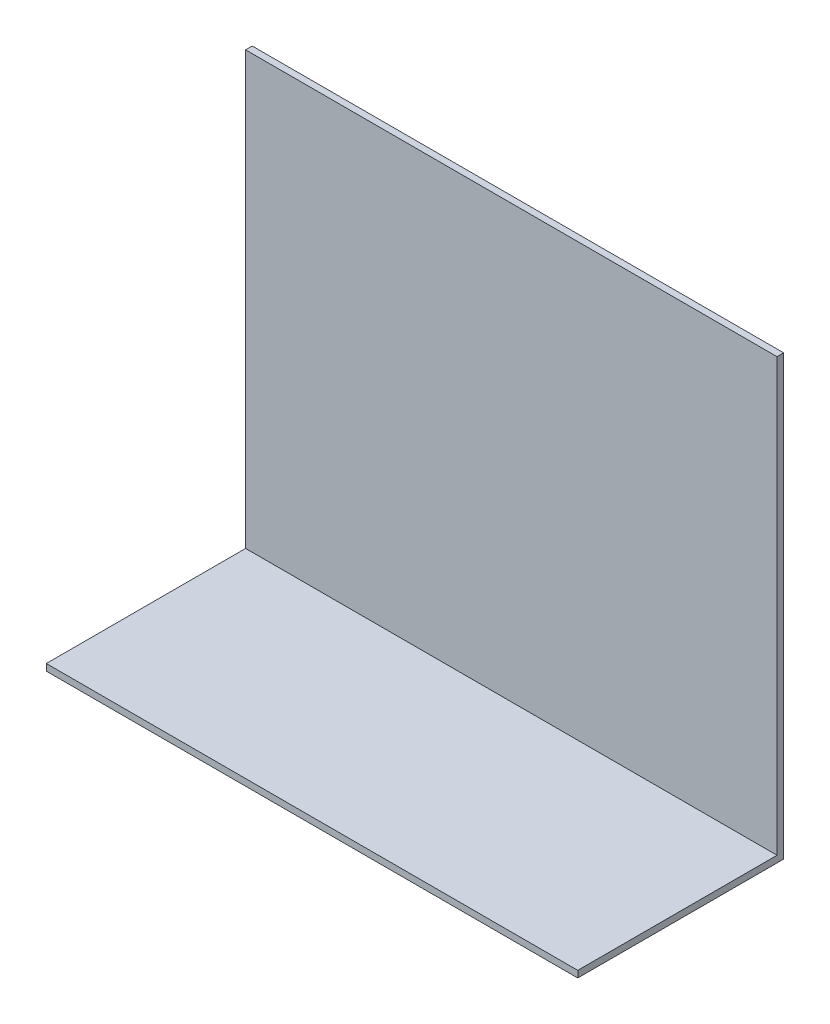
ISO-10303-21;
HEADER;
FILE_DESCRIPTION(('STEP AP214'),'2;1');
FILE_NAME('part.step','',(''),(''),'','','');
FILE_SCHEMA(('AUTOMOTIVE_DESIGN { 1 0 10303 214 1 1 1 1 }'));
ENDSEC;
DATA;
#1=APPLICATION_CONTEXT('core data for automotive mechanical design processes');
#2=APPLICATION_PROTOCOL_DEFINITION('international standard','automotive_design',2000,#1);
#3=PRODUCT_CONTEXT('',#1,'mechanical');
#4=PRODUCT('Part','Part','',(#3));
#5=PRODUCT_RELATED_PRODUCT_CATEGORY('part','',(#4));
#6=PRODUCT_DEFINITION_FORMATION('','',#4);
#7=PRODUCT_DEFINITION_CONTEXT('part definition',#1,'design');
#8=PRODUCT_DEFINITION('design','',#6,#7);
#9=PRODUCT_DEFINITION_SHAPE('','',#8);
#10=(LENGTH_UNIT() NAMED_UNIT(*) SI_UNIT(.MILLI.,.METRE.));
#11=(NAMED_UNIT(*) PLANE_ANGLE_UNIT() SI_UNIT($,.RADIAN.));
#12=(NAMED_UNIT(*) SI_UNIT($,.STERADIAN.) SOLID_ANGLE_UNIT());
#13=UNCERTAINTY_MEASURE_WITH_UNIT(LENGTH_MEASURE(1.E-05),#10,'distance_accuracy_value','');
#14=(GEOMETRIC_REPRESENTATION_CONTEXT(3) GLOBAL_UNCERTAINTY_ASSIGNED_CONTEXT((#13)) GLOBAL_UNIT_ASSIGNED_CONTEXT((#10,
#11,#12)) REPRESENTATION_CONTEXT('',''));
#15=CARTESIAN_POINT('',(0.,0.,0.));
#16=DIRECTION('',(0.,0.,1.));
#17=DIRECTION('',(1.,0.,0.));
#18=AXIS2_PLACEMENT_3D('',#15,#16,#17);
#19=CARTESIAN_POINT('',(0.,0.,5.));
#20=DIRECTION('',(0.,0.,-1.));
#21=DIRECTION('',(-1.,0.,0.));
#22=AXIS2_PLACEMENT_3D('',#19,#20,#21);
#23=PLANE('',#22);
#24=DIRECTION('',(-1.,0.,0.));
#25=VECTOR('',#24,1.);
#26=CARTESIAN_POINT('',(0.,-160.,5.));
#27=LINE('',#26,#25);
#28=CARTESIAN_POINT('',(200.,-160.,5.));
#29=VERTEX_POINT('',#28);
#30=CARTESIAN_POINT('',(-200.,-160.,5.));
#31=VERTEX_POINT('',#30);
#32=EDGE_CURVE('E48',#29,#31,#27,.T.);
#33=ORIENTED_EDGE('',*,*,#32,.F.);
#34=DIRECTION('',(0.,1.,0.));
#35=VECTOR('',#34,1.);
#36=CARTESIAN_POINT('',(200.,-165.,5.));
#37=LINE('',#36,#35);
#38=CARTESIAN_POINT('',(200.,165.,5.));
#39=VERTEX_POINT('',#38);
#40=EDGE_CURVE('E86',#29,#39,#37,.T.);
#41=ORIENTED_EDGE('',*,*,#40,.T.);
#42=DIRECTION('',(-1.,0.,0.));
#43=VECTOR('',#42,1.);
#44=CARTESIAN_POINT('',(-200.,165.,5.));
#45=LINE('',#44,#43);
#46=CARTESIAN_POINT('',(-200.,165.,5.));
#47=VERTEX_POINT('',#46);
#48=EDGE_CURVE('E54',#39,#47,#45,.T.);
#49=ORIENTED_EDGE('',*,*,#48,.T.);
#50=DIRECTION('',(0.,-1.,0.));
#51=VECTOR('',#50,1.);
#52=CARTESIAN_POINT('',(-200.,-165.,5.));
#53=LINE('',#52,#51);
#54=EDGE_CURVE('E97',#47,#31,#53,.T.);
#55=ORIENTED_EDGE('',*,*,#54,.T.);
#56=EDGE_LOOP('',(#33,#41,#49,#55));
#57=FACE_BOUND('',#56,.T.);
#58=ADVANCED_FACE('F33',(#57),#23,.F.);
#59=CARTESIAN_POINT('',(200.,-165.,5.));
#60=DIRECTION('',(-1.,0.,0.));
#61=DIRECTION('',(0.,0.,1.));
#62=AXIS2_PLACEMENT_3D('',#59,#60,#61);
#63=PLANE('',#62);
#64=DIRECTION('',(0.,1.,0.));
#65=VECTOR('',#64,1.);
#66=CARTESIAN_POINT('',(200.,-165.,0.));
#67=LINE('',#66,#65);
#68=CARTESIAN_POINT('',(200.,-165.,0.));
#69=VERTEX_POINT('',#68);
#70=CARTESIAN_POINT('',(200.,165.,0.));
#71=VERTEX_POINT('',#70);
#72=EDGE_CURVE('E93',#69,#71,#67,.T.);
#73=ORIENTED_EDGE('',*,*,#72,.T.);
#74=DIRECTION('',(0.,0.,-1.));
#75=VECTOR('',#74,1.);
#76=CARTESIAN_POINT('',(200.,165.,5.));
#77=LINE('',#76,#75);
#78=EDGE_CURVE('E11',#39,#71,#77,.T.);
#79=ORIENTED_EDGE('',*,*,#78,.F.);
#80=ORIENTED_EDGE('',*,*,#40,.F.);
#81=DIRECTION('',(0.,0.,-1.));
#82=VECTOR('',#81,1.);
#83=CARTESIAN_POINT('',(200.,-160.,155.));
#84=LINE('',#83,#82);
#85=CARTESIAN_POINT('',(200.,-160.,155.));
#86=VERTEX_POINT('',#85);
#87=EDGE_CURVE('E105',#86,#29,#84,.T.);
#88=ORIENTED_EDGE('',*,*,#87,.F.);
#89=DIRECTION('',(0.,1.,0.));
#90=VECTOR('',#89,1.);
#91=CARTESIAN_POINT('',(200.,0.,155.));
#92=LINE('',#91,#90);
#93=CARTESIAN_POINT('',(200.,-165.,155.));
#94=VERTEX_POINT('',#93);
#95=EDGE_CURVE('E96',#94,#86,#92,.T.);
#96=ORIENTED_EDGE('',*,*,#95,.F.);
#97=DIRECTION('',(0.,0.,-1.));
#98=VECTOR('',#97,1.);
#99=CARTESIAN_POINT('',(200.,-165.,5.));
#100=LINE('',#99,#98);
#101=EDGE_CURVE('E79',#94,#69,#100,.T.);
#102=ORIENTED_EDGE('',*,*,#101,.T.);
#103=EDGE_LOOP('',(#73,#79,#80,#88,#96,#102));
#104=FACE_BOUND('',#103,.T.);
#105=ADVANCED_FACE('F35',(#104),#63,.F.);
#106=CARTESIAN_POINT('',(-200.,165.,5.));
#107=DIRECTION('',(0.,-1.,0.));
#108=DIRECTION('',(0.,0.,-1.));
#109=AXIS2_PLACEMENT_3D('',#106,#107,#108);
#110=PLANE('',#109);
#111=DIRECTION('',(-1.,0.,0.));
#112=VECTOR('',#111,1.);
#113=CARTESIAN_POINT('',(-200.,165.,0.));
#114=LINE('',#113,#112);
#115=CARTESIAN_POINT('',(-200.,165.,0.));
#116=VERTEX_POINT('',#115);
#117=EDGE_CURVE('E100',#71,#116,#114,.T.);
#118=ORIENTED_EDGE('',*,*,#117,.T.);
#119=DIRECTION('',(0.,0.,-1.));
#120=VECTOR('',#119,1.);
#121=CARTESIAN_POINT('',(-200.,165.,5.));
#122=LINE('',#121,#120);
#123=EDGE_CURVE('E41',#47,#116,#122,.T.);
#124=ORIENTED_EDGE('',*,*,#123,.F.);
#125=ORIENTED_EDGE('',*,*,#48,.F.);
#126=ORIENTED_EDGE('',*,*,#78,.T.);
#127=EDGE_LOOP('',(#118,#124,#125,#126));
#128=FACE_BOUND('',#127,.T.);
#129=ADVANCED_FACE('F116',(#128),#110,.F.);
#130=CARTESIAN_POINT('',(-200.,-165.,5.));
#131=DIRECTION('',(1.,0.,0.));
#132=DIRECTION('',(0.,0.,-1.));
#133=AXIS2_PLACEMENT_3D('',#130,#131,#132);
#134=PLANE('',#133);
#135=DIRECTION('',(0.,-1.,0.));
#136=VECTOR('',#135,1.);
#137=CARTESIAN_POINT('',(-200.,-165.,0.));
#138=LINE('',#137,#136);
#139=CARTESIAN_POINT('',(-200.,-165.,0.));
#140=VERTEX_POINT('',#139);
#141=EDGE_CURVE('E87',#116,#140,#138,.T.);
#142=ORIENTED_EDGE('',*,*,#141,.T.);
#143=DIRECTION('',(0.,0.,-1.));
#144=VECTOR('',#143,1.);
#145=CARTESIAN_POINT('',(-200.,-165.,5.));
#146=LINE('',#145,#144);
#147=CARTESIAN_POINT('',(-200.,-165.,155.));
#148=VERTEX_POINT('',#147);
#149=EDGE_CURVE('E82',#148,#140,#146,.T.);
#150=ORIENTED_EDGE('',*,*,#149,.F.);
#151=DIRECTION('',(0.,-1.,0.));
#152=VECTOR('',#151,1.);
#153=CARTESIAN_POINT('',(-200.,0.,155.));
#154=LINE('',#153,#152);
#155=CARTESIAN_POINT('',(-200.,-160.,155.));
#156=VERTEX_POINT('',#155);
#157=EDGE_CURVE('E133',#156,#148,#154,.T.);
#158=ORIENTED_EDGE('',*,*,#157,.F.);
#159=DIRECTION('',(0.,0.,-1.));
#160=VECTOR('',#159,1.);
#161=CARTESIAN_POINT('',(-200.,-160.,155.));
#162=LINE('',#161,#160);
#163=EDGE_CURVE('E101',#156,#31,#162,.T.);
#164=ORIENTED_EDGE('',*,*,#163,.T.);
#165=ORIENTED_EDGE('',*,*,#54,.F.);
#166=ORIENTED_EDGE('',*,*,#123,.T.);
#167=EDGE_LOOP('',(#142,#150,#158,#164,#165,#166));
#168=FACE_BOUND('',#167,.T.);
#169=ADVANCED_FACE('F114',(#168),#134,.F.);
#170=CARTESIAN_POINT('',(-200.,-165.,5.));
#171=DIRECTION('',(0.,1.,0.));
#172=DIRECTION('',(0.,0.,1.));
#173=AXIS2_PLACEMENT_3D('',#170,#171,#172);
#174=PLANE('',#173);
#175=DIRECTION('',(1.,0.,0.));
#176=VECTOR('',#175,1.);
#177=CARTESIAN_POINT('',(-200.,-165.,0.));
#178=LINE('',#177,#176);
#179=EDGE_CURVE('E74',#140,#69,#178,.T.);
#180=ORIENTED_EDGE('',*,*,#179,.T.);
#181=ORIENTED_EDGE('',*,*,#101,.F.);
#182=DIRECTION('',(1.,0.,0.));
#183=VECTOR('',#182,1.);
#184=CARTESIAN_POINT('',(0.,-165.,155.));
#185=LINE('',#184,#183);
#186=EDGE_CURVE('E127',#148,#94,#185,.T.);
#187=ORIENTED_EDGE('',*,*,#186,.F.);
#188=ORIENTED_EDGE('',*,*,#149,.T.);
#189=EDGE_LOOP('',(#180,#181,#187,#188));
#190=FACE_BOUND('',#189,.T.);
#191=ADVANCED_FACE('F76',(#190),#174,.F.);
#192=CARTESIAN_POINT('',(0.,0.,0.));
#193=DIRECTION('',(0.,0.,-1.));
#194=DIRECTION('',(-1.,0.,0.));
#195=AXIS2_PLACEMENT_3D('',#192,#193,#194);
#196=PLANE('',#195);
#197=ORIENTED_EDGE('',*,*,#72,.F.);
#198=ORIENTED_EDGE('',*,*,#179,.F.);
#199=ORIENTED_EDGE('',*,*,#141,.F.);
#200=ORIENTED_EDGE('',*,*,#117,.F.);
#201=EDGE_LOOP('',(#197,#198,#199,#200));
#202=FACE_BOUND('',#201,.T.);
#203=ADVANCED_FACE('F99',(#202),#196,.T.);
#204=CARTESIAN_POINT('',(0.,-160.,155.));
#205=DIRECTION('',(0.,-1.,0.));
#206=DIRECTION('',(0.,0.,-1.));
#207=AXIS2_PLACEMENT_3D('',#204,#205,#206);
#208=PLANE('',#207);
#209=ORIENTED_EDGE('',*,*,#32,.T.);
#210=ORIENTED_EDGE('',*,*,#163,.F.);
#211=DIRECTION('',(-1.,0.,0.));
#212=VECTOR('',#211,1.);
#213=CARTESIAN_POINT('',(0.,-160.,155.));
#214=LINE('',#213,#212);
#215=EDGE_CURVE('E125',#86,#156,#214,.T.);
#216=ORIENTED_EDGE('',*,*,#215,.F.);
#217=ORIENTED_EDGE('',*,*,#87,.T.);
#218=EDGE_LOOP('',(#209,#210,#216,#217));
#219=FACE_BOUND('',#218,.T.);
#220=ADVANCED_FACE('F121',(#219),#208,.F.);
#221=CARTESIAN_POINT('',(0.,0.,155.));
#222=DIRECTION('',(0.,0.,1.));
#223=DIRECTION('',(1.,0.,0.));
#224=AXIS2_PLACEMENT_3D('',#221,#222,#223);
#225=PLANE('',#224);
#226=ORIENTED_EDGE('',*,*,#215,.T.);
#227=ORIENTED_EDGE('',*,*,#157,.T.);
#228=ORIENTED_EDGE('',*,*,#186,.T.);
#229=ORIENTED_EDGE('',*,*,#95,.T.);
#230=EDGE_LOOP('',(#226,#227,#228,#229));
#231=FACE_BOUND('',#230,.T.);
#232=ADVANCED_FACE('F140',(#231),#225,.T.);
#233=CLOSED_SHELL('',(#58,#105,#129,#169,#191,#203,#220,#232));
#234=MANIFOLD_SOLID_BREP('B2',#233);
#235=ADVANCED_BREP_SHAPE_REPRESENTATION('',(#18,#234),#14);
#236=SHAPE_DEFINITION_REPRESENTATION(#9,#235);
ENDSEC;
END-ISO-10303-21;
